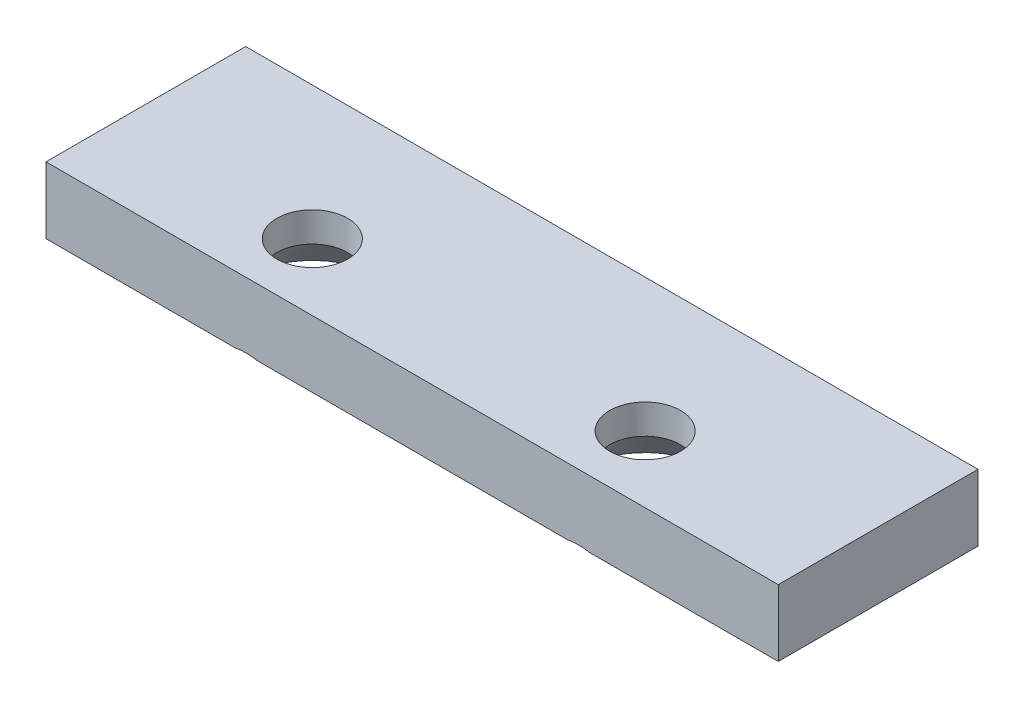
ISO-10303-21;
HEADER;
FILE_DESCRIPTION(('STEP AP214'),'2;1');
FILE_NAME('part.step','',(''),(''),'','','');
FILE_SCHEMA(('AUTOMOTIVE_DESIGN { 1 0 10303 214 1 1 1 1 }'));
ENDSEC;
DATA;
#1=APPLICATION_CONTEXT('core data for automotive mechanical design processes');
#2=APPLICATION_PROTOCOL_DEFINITION('international standard','automotive_design',2000,#1);
#3=PRODUCT_CONTEXT('',#1,'mechanical');
#4=PRODUCT('Part','Part','',(#3));
#5=PRODUCT_RELATED_PRODUCT_CATEGORY('part','',(#4));
#6=PRODUCT_DEFINITION_FORMATION('','',#4);
#7=PRODUCT_DEFINITION_CONTEXT('part definition',#1,'design');
#8=PRODUCT_DEFINITION('design','',#6,#7);
#9=PRODUCT_DEFINITION_SHAPE('','',#8);
#10=(LENGTH_UNIT() NAMED_UNIT(*) SI_UNIT(.MILLI.,.METRE.));
#11=(NAMED_UNIT(*) PLANE_ANGLE_UNIT() SI_UNIT($,.RADIAN.));
#12=(NAMED_UNIT(*) SI_UNIT($,.STERADIAN.) SOLID_ANGLE_UNIT());
#13=UNCERTAINTY_MEASURE_WITH_UNIT(LENGTH_MEASURE(1.E-05),#10,'distance_accuracy_value','');
#14=(GEOMETRIC_REPRESENTATION_CONTEXT(3) GLOBAL_UNCERTAINTY_ASSIGNED_CONTEXT((#13)) GLOBAL_UNIT_ASSIGNED_CONTEXT((#10,
#11,#12)) REPRESENTATION_CONTEXT('',''));
#15=CARTESIAN_POINT('',(0.,0.,0.));
#16=DIRECTION('',(0.,0.,1.));
#17=DIRECTION('',(1.,0.,0.));
#18=AXIS2_PLACEMENT_3D('',#15,#16,#17);
#19=CARTESIAN_POINT('',(0.,0.,0.));
#20=DIRECTION('',(0.,1.,0.));
#21=DIRECTION('',(0.,0.,1.));
#22=AXIS2_PLACEMENT_3D('',#19,#20,#21);
#23=PLANE('',#22);
#24=DIRECTION('',(1.,0.,0.));
#25=VECTOR('',#24,1.);
#26=CARTESIAN_POINT('',(34.925,0.,9.525));
#27=LINE('',#26,#25);
#28=CARTESIAN_POINT('',(-14.8087292979735,0.,9.525));
#29=VERTEX_POINT('',#28);
#30=CARTESIAN_POINT('',(14.8087292979735,0.,9.525));
#31=VERTEX_POINT('',#30);
#32=EDGE_CURVE('E96',#29,#31,#27,.T.);
#33=ORIENTED_EDGE('',*,*,#32,.F.);
#34=CARTESIAN_POINT('',(-15.875,0.,3.17500000000001));
#35=DIRECTION('',(0.,-1.,0.));
#36=DIRECTION('',(0.,0.,-1.));
#37=AXIS2_PLACEMENT_3D('',#34,#35,#36);
#38=CIRCLE('',#37,6.4389);
#39=CARTESIAN_POINT('',(-16.9412707020265,0.,9.525));
#40=VERTEX_POINT('',#39);
#41=EDGE_CURVE('E52',#40,#29,#38,.T.);
#42=ORIENTED_EDGE('',*,*,#41,.F.);
#43=CARTESIAN_POINT('',(-34.925,0.,9.52500000000001));
#44=VERTEX_POINT('',#43);
#45=EDGE_CURVE('E94',#44,#40,#27,.T.);
#46=ORIENTED_EDGE('',*,*,#45,.F.);
#47=DIRECTION('',(0.,0.,1.));
#48=VECTOR('',#47,1.);
#49=CARTESIAN_POINT('',(-34.925,0.,9.52500000000001));
#50=LINE('',#49,#48);
#51=CARTESIAN_POINT('',(-34.925,0.,-9.525));
#52=VERTEX_POINT('',#51);
#53=EDGE_CURVE('E109',#52,#44,#50,.T.);
#54=ORIENTED_EDGE('',*,*,#53,.F.);
#55=DIRECTION('',(-1.,0.,0.));
#56=VECTOR('',#55,1.);
#57=CARTESIAN_POINT('',(34.925,0.,-9.525));
#58=LINE('',#57,#56);
#59=CARTESIAN_POINT('',(34.925,0.,-9.525));
#60=VERTEX_POINT('',#59);
#61=EDGE_CURVE('E106',#60,#52,#58,.T.);
#62=ORIENTED_EDGE('',*,*,#61,.F.);
#63=DIRECTION('',(0.,0.,-1.));
#64=VECTOR('',#63,1.);
#65=CARTESIAN_POINT('',(34.925,0.,9.525));
#66=LINE('',#65,#64);
#67=CARTESIAN_POINT('',(34.925,0.,9.525));
#68=VERTEX_POINT('',#67);
#69=EDGE_CURVE('E103',#68,#60,#66,.T.);
#70=ORIENTED_EDGE('',*,*,#69,.F.);
#71=CARTESIAN_POINT('',(16.9412707020265,0.,9.525));
#72=VERTEX_POINT('',#71);
#73=EDGE_CURVE('E105',#72,#68,#27,.T.);
#74=ORIENTED_EDGE('',*,*,#73,.F.);
#75=CARTESIAN_POINT('',(15.875,0.,3.17500000000001));
#76=DIRECTION('',(0.,-1.,0.));
#77=DIRECTION('',(0.,0.,-1.));
#78=AXIS2_PLACEMENT_3D('',#75,#76,#77);
#79=CIRCLE('',#78,6.4389);
#80=EDGE_CURVE('E58',#31,#72,#79,.T.);
#81=ORIENTED_EDGE('',*,*,#80,.F.);
#82=EDGE_LOOP('',(#33,#42,#46,#54,#62,#70,#74,#81));
#83=FACE_BOUND('',#82,.T.);
#84=ADVANCED_FACE('F37',(#83),#23,.F.);
#85=CARTESIAN_POINT('',(-34.925,6.35,9.52500000000001));
#86=DIRECTION('',(1.,0.,0.));
#87=DIRECTION('',(0.,0.,-1.));
#88=AXIS2_PLACEMENT_3D('',#85,#86,#87);
#89=PLANE('',#88);
#90=ORIENTED_EDGE('',*,*,#53,.T.);
#91=DIRECTION('',(0.,-1.,0.));
#92=VECTOR('',#91,1.);
#93=CARTESIAN_POINT('',(-34.925,6.35,9.52500000000001));
#94=LINE('',#93,#92);
#95=CARTESIAN_POINT('',(-34.925,6.35,9.52500000000001));
#96=VERTEX_POINT('',#95);
#97=EDGE_CURVE('E101',#96,#44,#94,.T.);
#98=ORIENTED_EDGE('',*,*,#97,.F.);
#99=DIRECTION('',(0.,0.,1.));
#100=VECTOR('',#99,1.);
#101=CARTESIAN_POINT('',(-34.925,6.35,9.52500000000001));
#102=LINE('',#101,#100);
#103=CARTESIAN_POINT('',(-34.925,6.35,-9.525));
#104=VERTEX_POINT('',#103);
#105=EDGE_CURVE('E127',#104,#96,#102,.T.);
#106=ORIENTED_EDGE('',*,*,#105,.F.);
#107=DIRECTION('',(0.,-1.,0.));
#108=VECTOR('',#107,1.);
#109=CARTESIAN_POINT('',(-34.925,6.35,-9.525));
#110=LINE('',#109,#108);
#111=EDGE_CURVE('E122',#104,#52,#110,.T.);
#112=ORIENTED_EDGE('',*,*,#111,.T.);
#113=EDGE_LOOP('',(#90,#98,#106,#112));
#114=FACE_BOUND('',#113,.T.);
#115=ADVANCED_FACE('F39',(#114),#89,.F.);
#116=CARTESIAN_POINT('',(34.925,6.35,9.525));
#117=DIRECTION('',(0.,0.,-1.));
#118=DIRECTION('',(-1.,0.,0.));
#119=AXIS2_PLACEMENT_3D('',#116,#117,#118);
#120=PLANE('',#119);
#121=ORIENTED_EDGE('',*,*,#45,.T.);
#122=CARTESIAN_POINT('',(-27.111711159099,-7.44049863435224,9.525));
#123=CARTESIAN_POINT('',(-26.8900142030467,-7.21849015756915,9.525));
#124=CARTESIAN_POINT('',(-26.667542256843,-6.99724983861967,9.525));
#125=CARTESIAN_POINT('',(-26.2207269361642,-6.55664003875257,9.525));
#126=CARTESIAN_POINT('',(-25.9963834458083,-6.33727067540558,9.525));
#127=CARTESIAN_POINT('',(-25.5450365723273,-5.90028623391909,9.525));
#128=CARTESIAN_POINT('',(-25.3180284331912,-5.68267606083064,9.525));
#129=CARTESIAN_POINT('',(-24.8614402772959,-5.25017717701521,9.525));
#130=CARTESIAN_POINT('',(-24.6318603162047,-5.0352884075961,9.525));
#131=CARTESIAN_POINT('',(-24.1585834499174,-4.59864566538755,9.525));
#132=CARTESIAN_POINT('',(-23.9147361862689,-4.37705430918699,9.525));
#133=CARTESIAN_POINT('',(-23.4229513491406,-3.93846104766863,9.525));
#134=CARTESIAN_POINT('',(-23.1750139052078,-3.72145899749026,9.525));
#135=CARTESIAN_POINT('',(-22.6743363036637,-3.29350848564631,9.525));
#136=CARTESIAN_POINT('',(-22.4216006653825,-3.08255475577563,9.525));
#137=CARTESIAN_POINT('',(-21.9099478404146,-2.66831015855283,9.525));
#138=CARTESIAN_POINT('',(-21.6510314707663,-2.46501828743248,9.525));
#139=CARTESIAN_POINT('',(-21.1281336105893,-2.07065067132556,9.525));
#140=CARTESIAN_POINT('',(-20.8642305724747,-1.87947158899156,9.525));
#141=CARTESIAN_POINT('',(-20.3267950098655,-1.51061572665232,9.525));
#142=CARTESIAN_POINT('',(-20.0532564530896,-1.33294763314933,9.525));
#143=CARTESIAN_POINT('',(-19.4979277874575,-0.998671846402117,9.525));
#144=CARTESIAN_POINT('',(-19.2162756671133,-0.841837488695921,9.525));
#145=CARTESIAN_POINT('',(-18.6399434588664,-0.554590736614649,9.525));
#146=CARTESIAN_POINT('',(-18.3452854921684,-0.424135436114885,9.525));
#147=CARTESIAN_POINT('',(-17.9091312765299,-0.261975026432638,9.525));
#148=CARTESIAN_POINT('',(-17.7730720715034,-0.215562431120276,9.525));
#149=CARTESIAN_POINT('',(-17.4980518013536,-0.131027700414648,9.525));
#150=CARTESIAN_POINT('',(-17.3590850359654,-0.0929239354218723,9.525));
#151=CARTESIAN_POINT('',(-17.0568664073289,-0.0209405147070565,9.525));
#152=CARTESIAN_POINT('',(-16.8932267496986,0.0113370924355005,9.525));
#153=CARTESIAN_POINT('',(-16.5637336781002,0.0618266854283393,9.525));
#154=CARTESIAN_POINT('',(-16.3978798452994,0.080035970642632,9.525));
#155=CARTESIAN_POINT('',(-16.0653735476739,0.101477227280588,9.525));
#156=CARTESIAN_POINT('',(-15.8987221462168,0.10472544834034,9.525));
#157=CARTESIAN_POINT('',(-15.5658233357721,0.0961200895994071,9.525));
#158=CARTESIAN_POINT('',(-15.3995759050899,0.0842673395670288,9.525));
#159=CARTESIAN_POINT('',(-15.0748548445024,0.04676418634227,9.525));
#160=CARTESIAN_POINT('',(-14.916319837432,0.0216361356834017,9.525));
#161=CARTESIAN_POINT('',(-14.6017089591697,-0.0410063196867703,9.525));
#162=CARTESIAN_POINT('',(-14.4456336173354,-0.0785233535626019,9.525));
#163=CARTESIAN_POINT('',(-14.1363392905226,-0.164631083168577,9.525));
#164=CARTESIAN_POINT('',(-13.9831250963599,-0.213238815180771,9.525));
#165=CARTESIAN_POINT('',(-13.6801001299831,-0.320019125711714,9.525));
#166=CARTESIAN_POINT('',(-13.5302893658392,-0.378191726907621,9.525));
#167=CARTESIAN_POINT('',(-13.1875973384899,-0.522244538227998,9.525));
#168=CARTESIAN_POINT('',(-12.9959658390032,-0.611088805258831,9.525));
#169=CARTESIAN_POINT('',(-12.618318713848,-0.80007153651343,9.525));
#170=CARTESIAN_POINT('',(-12.4323056593269,-0.900215075206603,9.525));
#171=CARTESIAN_POINT('',(-12.0651152498202,-1.10968022612794,9.525));
#172=CARTESIAN_POINT('',(-11.8839471168858,-1.2190178983654,9.525));
#173=CARTESIAN_POINT('',(-11.5262247908719,-1.44490121428826,9.525));
#174=CARTESIAN_POINT('',(-11.3496699589198,-1.56144585231094,9.525));
#175=CARTESIAN_POINT('',(-10.997905138297,-1.80218428187398,9.525));
#176=CARTESIAN_POINT('',(-10.8227566771904,-1.92646759393923,9.525));
#177=CARTESIAN_POINT('',(-10.4760337242394,-2.17991598471892,9.525));
#178=CARTESIAN_POINT('',(-10.304459335972,-2.30908120460725,9.525));
#179=CARTESIAN_POINT('',(-9.96459171966463,-2.57127332720709,9.525));
#180=CARTESIAN_POINT('',(-9.79629514162397,-2.70429589943371,9.525));
#181=CARTESIAN_POINT('',(-9.4623879899918,-2.97364896321768,9.525));
#182=CARTESIAN_POINT('',(-9.29677730775431,-3.10997932041366,9.525));
#183=CARTESIAN_POINT('',(-8.94015407600521,-3.40863273587736,9.525));
#184=CARTESIAN_POINT('',(-8.74956656872407,-3.57146274092238,9.525));
#185=CARTESIAN_POINT('',(-8.37109782157846,-3.90024183582537,9.525));
#186=CARTESIAN_POINT('',(-8.18321666829348,-4.06619102508005,9.525));
#187=CARTESIAN_POINT('',(-7.62298876799084,-4.56794678192277,9.525));
#188=CARTESIAN_POINT('',(-7.25410562095834,-4.90762084472864,9.525));
#189=CARTESIAN_POINT('',(-6.52305798089859,-5.5944478567116,9.525));
#190=CARTESIAN_POINT('',(-6.16089701199625,-5.94160453344515,9.525));
#191=CARTESIAN_POINT('',(-5.44185225919592,-6.64135169863481,9.525));
#192=CARTESIAN_POINT('',(-5.08496863205281,-6.99394234786552,9.525));
#193=CARTESIAN_POINT('',(-4.37445769905771,-7.7041110244233,9.525));
#194=CARTESIAN_POINT('',(-4.02084051334288,-8.06169915437268,9.525));
#195=CARTESIAN_POINT('',(-3.31689204862131,-8.78010159743335,9.525));
#196=CARTESIAN_POINT('',(-2.96656081925208,-9.14091595911964,9.525));
#197=CARTESIAN_POINT('',(-2.26866397787441,-9.86498300824656,9.525));
#198=CARTESIAN_POINT('',(-1.9210975126397,-10.2282348741647,9.525));
#199=CARTESIAN_POINT('',(-1.2281348006846,-10.9568025583946,9.525));
#200=CARTESIAN_POINT('',(-0.882738559023628,-11.3221183815143,9.525));
#201=CARTESIAN_POINT('',(0.0664115082121239,-12.3309278995566,9.525));
#202=CARTESIAN_POINT('',(0.668306038715334,-12.9761706016911,9.525));
#203=CARTESIAN_POINT('',(1.86810653847955,-14.2704584029878,9.525));
#204=CARTESIAN_POINT('',(2.46601213121587,-14.9195038505358,9.525));
#205=CARTESIAN_POINT('',(3.65608879149467,-16.2175031467252,9.525));
#206=CARTESIAN_POINT('',(4.24827354443009,-16.8664444544405,9.525));
#207=CARTESIAN_POINT('',(5.13474399088667,-17.841432450539,9.525));
#208=CARTESIAN_POINT('',(5.42991695109478,-18.1666733120115,9.525));
#209=CARTESIAN_POINT('',(6.01973399384549,-18.8176335386324,9.525));
#210=CARTESIAN_POINT('',(6.31437807703815,-19.1433529031916,9.525));
#211=CARTESIAN_POINT('',(6.60878931525673,-19.4692826405457,9.525));
#212=B_SPLINE_CURVE_WITH_KNOTS('',3,(#122,#123,#124,#125,#126,#127,#128,#129,#130,#131,#132,
#133,#134,#135,#136,#137,#138,#139,#140,#141,#142,#143,#144,#145,#146,#147,#148,#149,#150,#151,
#152,#153,#154,#155,#156,#157,#158,#159,#160,#161,#162,#163,#164,#165,#166,#167,#168,#169,#170,
#171,#172,#173,#174,#175,#176,#177,#178,#179,#180,#181,#182,#183,#184,#185,#186,#187,#188,#189,
#190,#191,#192,#193,#194,#195,#196,#197,#198,#199,#200,#201,#202,#203,#204,#205,#206,#207,#208,
#209,#210,#211),.UNSPECIFIED.,.F.,.F.,(4,2,2,2,2,2,2,2,2,2,2,2,2,2,2,2,2,2,2,2,2,2,2,2,2,2,2,2,
2,2,2,2,2,2,2,2,2,2,2,2,2,2,2,2,4),(0.,0.941245744285924,1.88255020688061,2.82591995557513,
3.7692693239744,4.75769608842905,5.74609160667268,6.73359831121374,7.72097519111919,
8.69829509612916,9.67623811994311,10.642473541443,11.6071244887742,12.038175976081,
12.47017104461,12.9699798310953,13.4698845399265,13.9692461598396,14.468580342009,
14.9495884724645,15.4306987471472,15.9125530848653,16.3944085650186,17.0275964945746,
17.6610699273763,18.2956738393515,18.93018939741,19.5743774204067,20.2185840861591,
20.8620935760579,21.5055769703847,22.2575549291157,23.0095568913312,24.5137496198099,
26.0187098395435,27.5237146722482,29.0324067535716,30.5411215885474,32.0493511986965,
33.5575843236528,36.204732722755,38.852127553711,41.4876969415008,42.8053376883404,
44.1229768144943),.UNSPECIFIED.);
#213=EDGE_CURVE('E11',#40,#29,#212,.T.);
#214=ORIENTED_EDGE('',*,*,#213,.T.);
#215=ORIENTED_EDGE('',*,*,#32,.T.);
#216=CARTESIAN_POINT('',(4.63828884384023,-7.44049863140851,9.525));
#217=CARTESIAN_POINT('',(4.85998579981093,-7.21849015472123,9.525));
#218=CARTESIAN_POINT('',(5.08245774593284,-6.99724983586752,9.525));
#219=CARTESIAN_POINT('',(5.5292730664479,-6.55664003619175,9.525));
#220=CARTESIAN_POINT('',(5.75361655672172,-6.33727067294033,9.525));
#221=CARTESIAN_POINT('',(6.20496343003784,-5.900286231645,9.525));
#222=CARTESIAN_POINT('',(6.43197156909108,-5.68267605865213,9.525));
#223=CARTESIAN_POINT('',(6.88855972482015,-5.25017717502742,9.525));
#224=CARTESIAN_POINT('',(7.1181396858279,-5.03528840570343,9.525));
#225=CARTESIAN_POINT('',(7.59141655193916,-4.59864566369289,9.525));
#226=CARTESIAN_POINT('',(7.83526381549503,-4.37705430759512,9.525));
#227=CARTESIAN_POINT('',(8.32704865243634,-3.93846104628099,9.525));
#228=CARTESIAN_POINT('',(8.57498609627495,-3.72145899620405,9.525));
#229=CARTESIAN_POINT('',(9.0756636976284,-3.29350848456073,9.525));
#230=CARTESIAN_POINT('',(9.32839933581334,-3.08255475478924,9.525));
#231=CARTESIAN_POINT('',(9.84005216058538,-2.66831015776151,9.525));
#232=CARTESIAN_POINT('',(10.0989685301341,-2.46501828673705,9.525));
#233=CARTESIAN_POINT('',(10.6218663901659,-2.07065067077216,9.525));
#234=CARTESIAN_POINT('',(10.8857694282366,-1.87947158848658,9.525));
#235=CARTESIAN_POINT('',(11.4232049907559,-1.51061572624259,9.525));
#236=CARTESIAN_POINT('',(11.6967435474858,-1.33294763278643,9.525));
#237=CARTESIAN_POINT('',(12.252072213024,-0.998671846128622,9.525));
#238=CARTESIAN_POINT('',(12.5337243333204,-0.841837488465082,9.525));
#239=CARTESIAN_POINT('',(13.1100565414673,-0.554590736462974,9.525));
#240=CARTESIAN_POINT('',(13.4047145081131,-0.42413543599974,9.525));
#241=CARTESIAN_POINT('',(13.8408687236816,-0.261975026358643,9.525));
#242=CARTESIAN_POINT('',(13.9769279286928,-0.215562431055932,9.525));
#243=CARTESIAN_POINT('',(14.2519481988111,-0.131027700368046,9.525));
#244=CARTESIAN_POINT('',(14.3909149641831,-0.0929239353833549,9.525));
#245=CARTESIAN_POINT('',(14.6931335927669,-0.0209405146878482,9.525));
#246=CARTESIAN_POINT('',(14.8567732503603,0.0113370924451531,9.525));
#247=CARTESIAN_POINT('',(15.1862663218838,0.0618266854252642,9.525));
#248=CARTESIAN_POINT('',(15.3521201546465,0.0800359706363868,9.525));
#249=CARTESIAN_POINT('',(15.6846264521958,0.101477227274954,9.525));
#250=CARTESIAN_POINT('',(15.8512778536147,0.104725448338482,9.525));
#251=CARTESIAN_POINT('',(16.1841766639838,0.0961200896119413,9.525));
#252=CARTESIAN_POINT('',(16.3504240946285,0.0842673395901748,9.525));
#253=CARTESIAN_POINT('',(16.6751451552072,0.0467641863848611,9.525));
#254=CARTESIAN_POINT('',(16.8336801623055,0.021636135729283,9.525));
#255=CARTESIAN_POINT('',(17.1482910406231,-0.0410063196391173,9.525));
#256=CARTESIAN_POINT('',(17.3043663824849,-0.0785233535164715,9.525));
#257=CARTESIAN_POINT('',(17.6136607093521,-0.164631083129775,9.525));
#258=CARTESIAN_POINT('',(17.7668749035417,-0.213238815147805,9.525));
#259=CARTESIAN_POINT('',(18.0698998699712,-0.32001912569391,9.525));
#260=CARTESIAN_POINT('',(18.2197106341409,-0.378191726899141,9.525));
#261=CARTESIAN_POINT('',(18.5624026615151,-0.522244538230218,9.525));
#262=CARTESIAN_POINT('',(18.7540341610014,-0.611088805261008,9.525));
#263=CARTESIAN_POINT('',(19.1316812861558,-0.800071536515461,9.525));
#264=CARTESIAN_POINT('',(19.3176943406766,-0.900215075208532,9.525));
#265=CARTESIAN_POINT('',(19.6848847501826,-1.10968022612962,9.525));
#266=CARTESIAN_POINT('',(19.8660528831167,-1.21901789836692,9.525));
#267=CARTESIAN_POINT('',(20.2237752091299,-1.44490121428944,9.525));
#268=CARTESIAN_POINT('',(20.4003300410817,-1.56144585231192,9.525));
#269=CARTESIAN_POINT('',(20.7520948617037,-1.80218428187444,9.525));
#270=CARTESIAN_POINT('',(20.9272433228097,-1.92646759393933,9.525));
#271=CARTESIAN_POINT('',(21.2739662757597,-2.17991598471829,9.525));
#272=CARTESIAN_POINT('',(21.4455406640266,-2.30908120460625,9.525));
#273=CARTESIAN_POINT('',(21.7854082803331,-2.57127332720532,9.525));
#274=CARTESIAN_POINT('',(21.9537048583733,-2.70429589943155,9.525));
#275=CARTESIAN_POINT('',(22.2876120100046,-2.97364896321472,9.525));
#276=CARTESIAN_POINT('',(22.4532226922416,-3.10997932041028,9.525));
#277=CARTESIAN_POINT('',(22.8098459239903,-3.40863273587356,9.525));
#278=CARTESIAN_POINT('',(23.0004334312715,-3.57146274091856,9.525));
#279=CARTESIAN_POINT('',(23.3789021784172,-3.90024183582152,9.525));
#280=CARTESIAN_POINT('',(23.5667833317022,-4.06619102507619,9.525));
#281=CARTESIAN_POINT('',(24.1270112320049,-4.56794678191887,9.525));
#282=CARTESIAN_POINT('',(24.4958943790374,-4.90762084472472,9.525));
#283=CARTESIAN_POINT('',(25.2269420190973,-5.59444785670766,9.525));
#284=CARTESIAN_POINT('',(25.5891029879997,-5.9416045334412,9.525));
#285=CARTESIAN_POINT('',(26.3081477408001,-6.64135169863086,9.525));
#286=CARTESIAN_POINT('',(26.6650313679432,-6.99394234786158,9.525));
#287=CARTESIAN_POINT('',(27.3755423009384,-7.70411102441935,9.525));
#288=CARTESIAN_POINT('',(27.7291594866532,-8.06169915436874,9.525));
#289=CARTESIAN_POINT('',(28.4331079513749,-8.78010159742941,9.525));
#290=CARTESIAN_POINT('',(28.7834391807441,-9.14091595911571,9.525));
#291=CARTESIAN_POINT('',(29.4813360221218,-9.86498300824264,9.525));
#292=CARTESIAN_POINT('',(29.8289024873566,-10.2282348741607,9.525));
#293=CARTESIAN_POINT('',(30.5218651993117,-10.9568025583907,9.525));
#294=CARTESIAN_POINT('',(30.8672614409727,-11.3221183815104,9.525));
#295=CARTESIAN_POINT('',(31.8164115082091,-12.3309278995534,9.525));
#296=CARTESIAN_POINT('',(32.4183060387129,-12.9761706016886,9.525));
#297=CARTESIAN_POINT('',(33.6181065384784,-14.2704584029866,9.525));
#298=CARTESIAN_POINT('',(34.2160121312153,-14.9195038505352,9.525));
#299=CARTESIAN_POINT('',(35.4060887914953,-16.217503146726,9.525));
#300=CARTESIAN_POINT('',(35.9982735444314,-16.8664444544419,9.525));
#301=CARTESIAN_POINT('',(36.8847439908889,-17.8414324505414,9.525));
#302=CARTESIAN_POINT('',(37.1799169510973,-18.1666733120143,9.525));
#303=CARTESIAN_POINT('',(37.7697339938486,-18.8176335386358,9.525));
#304=CARTESIAN_POINT('',(38.0643780770415,-19.1433529031953,9.525));
#305=CARTESIAN_POINT('',(38.3587893152604,-19.4692826405497,9.525));
#306=B_SPLINE_CURVE_WITH_KNOTS('',3,(#216,#217,#218,#219,#220,#221,#222,#223,#224,#225,#226,
#227,#228,#229,#230,#231,#232,#233,#234,#235,#236,#237,#238,#239,#240,#241,#242,#243,#244,#245,
#246,#247,#248,#249,#250,#251,#252,#253,#254,#255,#256,#257,#258,#259,#260,#261,#262,#263,#264,
#265,#266,#267,#268,#269,#270,#271,#272,#273,#274,#275,#276,#277,#278,#279,#280,#281,#282,#283,
#284,#285,#286,#287,#288,#289,#290,#291,#292,#293,#294,#295,#296,#297,#298,#299,#300,#301,#302,
#303,#304,#305),.UNSPECIFIED.,.F.,.F.,(4,2,2,2,2,2,2,2,2,2,2,2,2,2,2,2,2,2,2,2,2,2,2,2,2,2,2,2,
2,2,2,2,2,2,2,2,2,2,2,2,2,2,2,2,4),(0.,0.941245743909448,1.88255020612764,2.82591995444439,
3.7692693224659,4.75769608650736,5.74609160433784,6.7335983084664,7.72097518795947,
8.6982950927776,9.67623811639934,10.6424735377118,11.6071244848563,12.0381759721103,
12.4701710405862,12.9699798269575,13.4698845356747,13.969246155474,14.4685803375295,
14.9495884680659,15.4306987428295,15.9125530806296,16.394408560865,17.02759649042,
17.6610699232206,18.2956738351947,18.930189393252,19.5743774162469,20.2185840819974,
20.8620935718945,21.5055769662194,22.2575549249505,23.009556887166,24.5137496156448,
26.0187098353784,27.5237146680833,29.0324067494068,30.5411215843826,32.0493511945317,
33.5575843194882,36.204732718593,38.8521275495518,41.4876969373442,42.8053376841852,
44.1229768103404),.UNSPECIFIED.);
#307=EDGE_CURVE('E46',#31,#72,#306,.T.);
#308=ORIENTED_EDGE('',*,*,#307,.T.);
#309=ORIENTED_EDGE('',*,*,#73,.T.);
#310=DIRECTION('',(0.,-1.,0.));
#311=VECTOR('',#310,1.);
#312=CARTESIAN_POINT('',(34.925,6.35,9.525));
#313=LINE('',#312,#311);
#314=CARTESIAN_POINT('',(34.925,6.35,9.525));
#315=VERTEX_POINT('',#314);
#316=EDGE_CURVE('E152',#315,#68,#313,.T.);
#317=ORIENTED_EDGE('',*,*,#316,.F.);
#318=DIRECTION('',(1.,0.,0.));
#319=VECTOR('',#318,1.);
#320=CARTESIAN_POINT('',(34.925,6.35,9.525));
#321=LINE('',#320,#319);
#322=EDGE_CURVE('E125',#96,#315,#321,.T.);
#323=ORIENTED_EDGE('',*,*,#322,.F.);
#324=ORIENTED_EDGE('',*,*,#97,.T.);
#325=EDGE_LOOP('',(#121,#214,#215,#308,#309,#317,#323,#324));
#326=FACE_BOUND('',#325,.T.);
#327=ADVANCED_FACE('F99',(#326),#120,.F.);
#328=CARTESIAN_POINT('',(34.925,6.35,9.525));
#329=DIRECTION('',(-1.,0.,0.));
#330=DIRECTION('',(0.,0.,1.));
#331=AXIS2_PLACEMENT_3D('',#328,#329,#330);
#332=PLANE('',#331);
#333=ORIENTED_EDGE('',*,*,#69,.T.);
#334=DIRECTION('',(0.,-1.,0.));
#335=VECTOR('',#334,1.);
#336=CARTESIAN_POINT('',(34.925,6.35,-9.525));
#337=LINE('',#336,#335);
#338=CARTESIAN_POINT('',(34.925,6.35,-9.525));
#339=VERTEX_POINT('',#338);
#340=EDGE_CURVE('E155',#339,#60,#337,.T.);
#341=ORIENTED_EDGE('',*,*,#340,.F.);
#342=DIRECTION('',(0.,0.,-1.));
#343=VECTOR('',#342,1.);
#344=CARTESIAN_POINT('',(34.925,6.35,9.525));
#345=LINE('',#344,#343);
#346=EDGE_CURVE('E123',#315,#339,#345,.T.);
#347=ORIENTED_EDGE('',*,*,#346,.F.);
#348=ORIENTED_EDGE('',*,*,#316,.T.);
#349=EDGE_LOOP('',(#333,#341,#347,#348));
#350=FACE_BOUND('',#349,.T.);
#351=ADVANCED_FACE('F178',(#350),#332,.F.);
#352=CARTESIAN_POINT('',(34.925,6.35,-9.525));
#353=DIRECTION('',(0.,0.,1.));
#354=DIRECTION('',(1.,0.,0.));
#355=AXIS2_PLACEMENT_3D('',#352,#353,#354);
#356=PLANE('',#355);
#357=ORIENTED_EDGE('',*,*,#61,.T.);
#358=ORIENTED_EDGE('',*,*,#111,.F.);
#359=DIRECTION('',(-1.,0.,0.));
#360=VECTOR('',#359,1.);
#361=CARTESIAN_POINT('',(34.925,6.35,-9.525));
#362=LINE('',#361,#360);
#363=EDGE_CURVE('E120',#339,#104,#362,.T.);
#364=ORIENTED_EDGE('',*,*,#363,.F.);
#365=ORIENTED_EDGE('',*,*,#340,.T.);
#366=EDGE_LOOP('',(#357,#358,#364,#365));
#367=FACE_BOUND('',#366,.T.);
#368=ADVANCED_FACE('F145',(#367),#356,.F.);
#369=CARTESIAN_POINT('',(0.,6.35,0.));
#370=DIRECTION('',(0.,1.,0.));
#371=DIRECTION('',(0.,0.,1.));
#372=AXIS2_PLACEMENT_3D('',#369,#370,#371);
#373=PLANE('',#372);
#374=CARTESIAN_POINT('',(-15.875,6.35,3.17500000000001));
#375=DIRECTION('',(0.,1.,0.));
#376=DIRECTION('',(0.,0.,1.));
#377=AXIS2_PLACEMENT_3D('',#374,#375,#376);
#378=CIRCLE('',#377,3.3782);
#379=CARTESIAN_POINT('',(-15.875,6.35,6.5532));
#380=VERTEX_POINT('',#379);
#381=EDGE_CURVE('E41',#380,#380,#378,.T.);
#382=ORIENTED_EDGE('',*,*,#381,.F.);
#383=EDGE_LOOP('',(#382));
#384=FACE_BOUND('',#383,.T.);
#385=CARTESIAN_POINT('',(15.875,6.35,3.17500000000001));
#386=DIRECTION('',(0.,1.,0.));
#387=DIRECTION('',(0.,0.,1.));
#388=AXIS2_PLACEMENT_3D('',#385,#386,#387);
#389=CIRCLE('',#388,3.3782);
#390=CARTESIAN_POINT('',(15.875,6.35,6.5532));
#391=VERTEX_POINT('',#390);
#392=EDGE_CURVE('E113',#391,#391,#389,.T.);
#393=ORIENTED_EDGE('',*,*,#392,.F.);
#394=EDGE_LOOP('',(#393));
#395=FACE_BOUND('',#394,.T.);
#396=ORIENTED_EDGE('',*,*,#105,.T.);
#397=ORIENTED_EDGE('',*,*,#322,.T.);
#398=ORIENTED_EDGE('',*,*,#346,.T.);
#399=ORIENTED_EDGE('',*,*,#363,.T.);
#400=EDGE_LOOP('',(#396,#397,#398,#399));
#401=FACE_BOUND('',#400,.T.);
#402=ADVANCED_FACE('F141',(#384,#395,#401),#373,.T.);
#403=CARTESIAN_POINT('',(15.875,0.,3.17500000000001));
#404=DIRECTION('',(0.,-1.,0.));
#405=DIRECTION('',(0.,0.,-1.));
#406=AXIS2_PLACEMENT_3D('',#403,#404,#405);
#407=CONICAL_SURFACE('',#406,6.4389,0.715584993317676);
#408=CARTESIAN_POINT('',(15.875,3.52093258398134,3.17500000000001));
#409=DIRECTION('',(0.,-1.,0.));
#410=DIRECTION('',(0.,0.,-1.));
#411=AXIS2_PLACEMENT_3D('',#408,#409,#410);
#412=CIRCLE('',#411,3.3782);
#413=CARTESIAN_POINT('',(15.875,3.52093258398134,-0.203199999999992));
#414=VERTEX_POINT('',#413);
#415=EDGE_CURVE('E117',#414,#414,#412,.T.);
#416=ORIENTED_EDGE('',*,*,#415,.F.);
#417=EDGE_LOOP('',(#416));
#418=FACE_BOUND('',#417,.T.);
#419=ORIENTED_EDGE('',*,*,#80,.T.);
#420=ORIENTED_EDGE('',*,*,#307,.F.);
#421=EDGE_LOOP('',(#419,#420));
#422=FACE_BOUND('',#421,.T.);
#423=ADVANCED_FACE('F144',(#418,#422),#407,.F.);
#424=CARTESIAN_POINT('',(15.875,0.,3.17500000000001));
#425=DIRECTION('',(0.,-1.,0.));
#426=DIRECTION('',(0.,0.,-1.));
#427=AXIS2_PLACEMENT_3D('',#424,#425,#426);
#428=CYLINDRICAL_SURFACE('',#427,3.3782);
#429=ORIENTED_EDGE('',*,*,#392,.T.);
#430=EDGE_LOOP('',(#429));
#431=FACE_BOUND('',#430,.T.);
#432=ORIENTED_EDGE('',*,*,#415,.T.);
#433=EDGE_LOOP('',(#432));
#434=FACE_BOUND('',#433,.T.);
#435=ADVANCED_FACE('F169',(#431,#434),#428,.F.);
#436=CARTESIAN_POINT('',(-15.875,0.,3.17500000000001));
#437=DIRECTION('',(0.,-1.,0.));
#438=DIRECTION('',(0.,0.,-1.));
#439=AXIS2_PLACEMENT_3D('',#436,#437,#438);
#440=CONICAL_SURFACE('',#439,6.4389,0.715584993317676);
#441=CARTESIAN_POINT('',(-15.875,3.52093258398134,3.17500000000001));
#442=DIRECTION('',(0.,-1.,0.));
#443=DIRECTION('',(0.,0.,-1.));
#444=AXIS2_PLACEMENT_3D('',#441,#442,#443);
#445=CIRCLE('',#444,3.3782);
#446=CARTESIAN_POINT('',(-15.875,3.52093258398134,-0.203199999999993));
#447=VERTEX_POINT('',#446);
#448=EDGE_CURVE('E97',#447,#447,#445,.T.);
#449=ORIENTED_EDGE('',*,*,#448,.F.);
#450=EDGE_LOOP('',(#449));
#451=FACE_BOUND('',#450,.T.);
#452=ORIENTED_EDGE('',*,*,#41,.T.);
#453=ORIENTED_EDGE('',*,*,#213,.F.);
#454=EDGE_LOOP('',(#452,#453));
#455=FACE_BOUND('',#454,.T.);
#456=ADVANCED_FACE('F88',(#451,#455),#440,.F.);
#457=CARTESIAN_POINT('',(-15.875,0.,3.17500000000001));
#458=DIRECTION('',(0.,-1.,0.));
#459=DIRECTION('',(0.,0.,-1.));
#460=AXIS2_PLACEMENT_3D('',#457,#458,#459);
#461=CYLINDRICAL_SURFACE('',#460,3.3782);
#462=ORIENTED_EDGE('',*,*,#381,.T.);
#463=EDGE_LOOP('',(#462));
#464=FACE_BOUND('',#463,.T.);
#465=ORIENTED_EDGE('',*,*,#448,.T.);
#466=EDGE_LOOP('',(#465));
#467=FACE_BOUND('',#466,.T.);
#468=ADVANCED_FACE('F139',(#464,#467),#461,.F.);
#469=CLOSED_SHELL('',(#84,#115,#327,#351,#368,#402,#423,#435,#456,#468));
#470=MANIFOLD_SOLID_BREP('B2',#469);
#471=ADVANCED_BREP_SHAPE_REPRESENTATION('',(#18,#470),#14);
#472=SHAPE_DEFINITION_REPRESENTATION(#9,#471);
ENDSEC;
END-ISO-10303-21;
